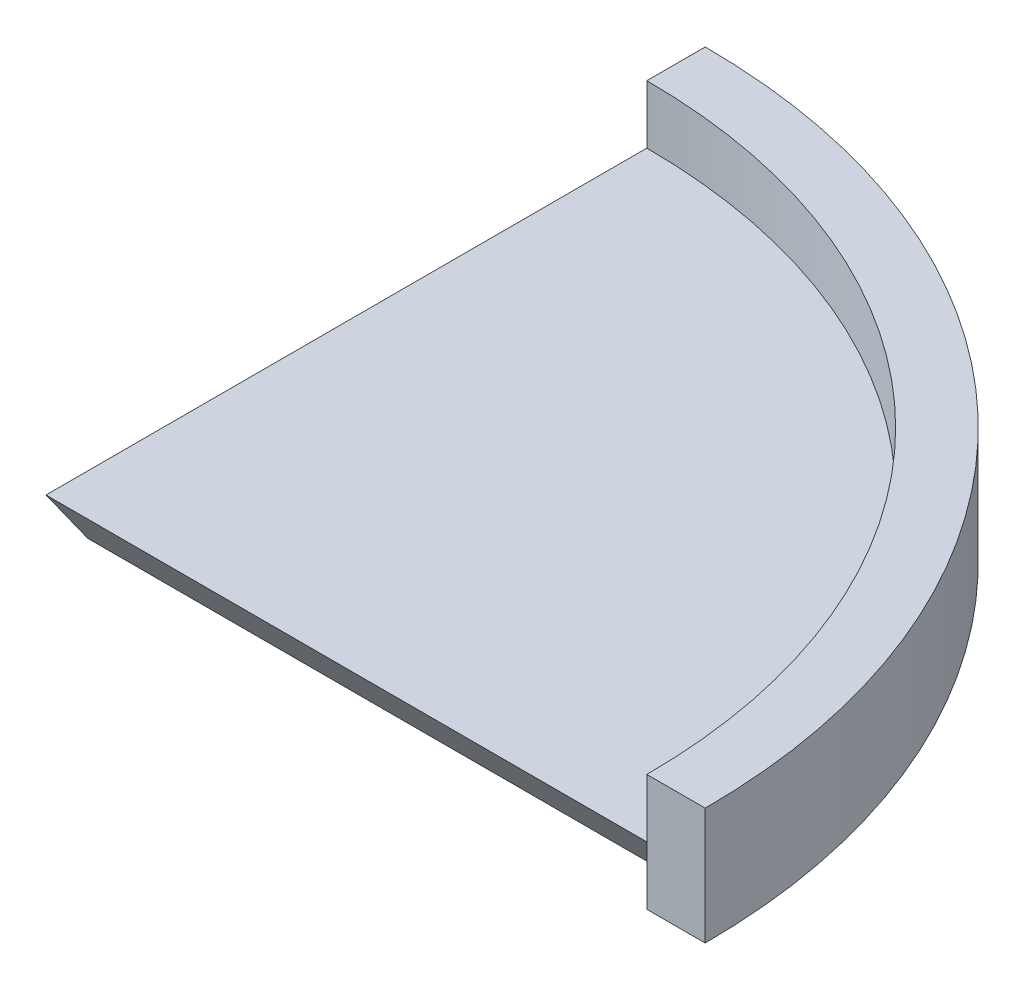
ISO-10303-21;
HEADER;
FILE_DESCRIPTION(('STEP AP214'),'2;1');
FILE_NAME('part.step','',(''),(''),'','','');
FILE_SCHEMA(('AUTOMOTIVE_DESIGN { 1 0 10303 214 1 1 1 1 }'));
ENDSEC;
DATA;
#1=APPLICATION_CONTEXT('core data for automotive mechanical design processes');
#2=APPLICATION_PROTOCOL_DEFINITION('international standard','automotive_design',2000,#1);
#3=PRODUCT_CONTEXT('',#1,'mechanical');
#4=PRODUCT('Part','Part','',(#3));
#5=PRODUCT_RELATED_PRODUCT_CATEGORY('part','',(#4));
#6=PRODUCT_DEFINITION_FORMATION('','',#4);
#7=PRODUCT_DEFINITION_CONTEXT('part definition',#1,'design');
#8=PRODUCT_DEFINITION('design','',#6,#7);
#9=PRODUCT_DEFINITION_SHAPE('','',#8);
#10=(LENGTH_UNIT() NAMED_UNIT(*) SI_UNIT(.MILLI.,.METRE.));
#11=(NAMED_UNIT(*) PLANE_ANGLE_UNIT() SI_UNIT($,.RADIAN.));
#12=(NAMED_UNIT(*) SI_UNIT($,.STERADIAN.) SOLID_ANGLE_UNIT());
#13=UNCERTAINTY_MEASURE_WITH_UNIT(LENGTH_MEASURE(1.E-05),#10,'distance_accuracy_value','');
#14=(GEOMETRIC_REPRESENTATION_CONTEXT(3) GLOBAL_UNCERTAINTY_ASSIGNED_CONTEXT((#13)) GLOBAL_UNIT_ASSIGNED_CONTEXT((#10,
#11,#12)) REPRESENTATION_CONTEXT('',''));
#15=CARTESIAN_POINT('',(0.,0.,0.));
#16=DIRECTION('',(0.,0.,1.));
#17=DIRECTION('',(1.,0.,0.));
#18=AXIS2_PLACEMENT_3D('',#15,#16,#17);
#19=CARTESIAN_POINT('',(0.,408.76275485835,925.416095405554));
#20=DIRECTION('',(0.,-1.,0.));
#21=DIRECTION('',(0.,0.,-1.));
#22=AXIS2_PLACEMENT_3D('',#19,#20,#21);
#23=PLANE('',#22);
#24=DIRECTION('',(-1.,0.,0.));
#25=VECTOR('',#24,1.);
#26=CARTESIAN_POINT('',(0.,408.76275485835,925.416095405554));
#27=LINE('',#26,#25);
#28=CARTESIAN_POINT('',(360.,408.76275485835,925.416095405554));
#29=VERTEX_POINT('',#28);
#30=CARTESIAN_POINT('',(0.,408.76275485835,925.416095405554));
#31=VERTEX_POINT('',#30);
#32=EDGE_CURVE('E43',#29,#31,#27,.T.);
#33=ORIENTED_EDGE('',*,*,#32,.F.);
#34=CARTESIAN_POINT('',(0.,408.76275485835,925.416095405554));
#35=DIRECTION('',(0.,1.,0.));
#36=DIRECTION('',(0.,0.,1.));
#37=AXIS2_PLACEMENT_3D('',#34,#35,#36);
#38=CIRCLE('',#37,360.);
#39=CARTESIAN_POINT('',(0.,408.76275485835,565.416095405554));
#40=VERTEX_POINT('',#39);
#41=EDGE_CURVE('E104',#29,#40,#38,.T.);
#42=ORIENTED_EDGE('',*,*,#41,.T.);
#43=DIRECTION('',(0.,0.,1.));
#44=VECTOR('',#43,1.);
#45=CARTESIAN_POINT('',(0.,408.76275485835,925.416095405554));
#46=LINE('',#45,#44);
#47=EDGE_CURVE('E117',#40,#31,#46,.T.);
#48=ORIENTED_EDGE('',*,*,#47,.T.);
#49=EDGE_LOOP('',(#33,#42,#48));
#50=FACE_BOUND('',#49,.T.);
#51=ADVANCED_FACE('F35',(#50),#23,.F.);
#52=CARTESIAN_POINT('',(0.,373.76275485835,925.416095405554));
#53=DIRECTION('',(0.,1.,0.));
#54=DIRECTION('',(0.,0.,1.));
#55=AXIS2_PLACEMENT_3D('',#52,#53,#54);
#56=PLANE('',#55);
#57=DIRECTION('',(0.,0.,1.));
#58=VECTOR('',#57,1.);
#59=CARTESIAN_POINT('',(360.,373.76275485835,925.416095405554));
#60=LINE('',#59,#58);
#61=CARTESIAN_POINT('',(360.,373.76275485835,900.416095405554));
#62=VERTEX_POINT('',#61);
#63=CARTESIAN_POINT('',(360.,373.76275485835,925.416095405554));
#64=VERTEX_POINT('',#63);
#65=EDGE_CURVE('E93',#62,#64,#60,.T.);
#66=ORIENTED_EDGE('',*,*,#65,.F.);
#67=DIRECTION('',(-1.,0.,0.));
#68=VECTOR('',#67,1.);
#69=CARTESIAN_POINT('',(360.,373.76275485835,900.416095405554));
#70=LINE('',#69,#68);
#71=CARTESIAN_POINT('',(0.,373.76275485835,900.416095405554));
#72=VERTEX_POINT('',#71);
#73=EDGE_CURVE('E90',#62,#72,#70,.T.);
#74=ORIENTED_EDGE('',*,*,#73,.T.);
#75=DIRECTION('',(0.,0.,-1.));
#76=VECTOR('',#75,1.);
#77=CARTESIAN_POINT('',(0.,373.76275485835,925.416095405554));
#78=LINE('',#77,#76);
#79=CARTESIAN_POINT('',(0.,373.76275485835,530.416095405554));
#80=VERTEX_POINT('',#79);
#81=EDGE_CURVE('E126',#72,#80,#78,.T.);
#82=ORIENTED_EDGE('',*,*,#81,.T.);
#83=CARTESIAN_POINT('',(0.,373.76275485835,925.416095405554));
#84=DIRECTION('',(0.,1.,0.));
#85=DIRECTION('',(0.,0.,1.));
#86=AXIS2_PLACEMENT_3D('',#83,#84,#85);
#87=CIRCLE('',#86,395.);
#88=CARTESIAN_POINT('',(395.,373.76275485835,925.416095405555));
#89=VERTEX_POINT('',#88);
#90=EDGE_CURVE('E11',#89,#80,#87,.T.);
#91=ORIENTED_EDGE('',*,*,#90,.F.);
#92=DIRECTION('',(1.,0.,0.));
#93=VECTOR('',#92,1.);
#94=CARTESIAN_POINT('',(0.,373.76275485835,925.416095405554));
#95=LINE('',#94,#93);
#96=EDGE_CURVE('E119',#64,#89,#95,.T.);
#97=ORIENTED_EDGE('',*,*,#96,.F.);
#98=EDGE_LOOP('',(#66,#74,#82,#91,#97));
#99=FACE_BOUND('',#98,.T.);
#100=ADVANCED_FACE('F37',(#99),#56,.F.);
#101=CARTESIAN_POINT('',(0.,408.76275485835,925.416095405554));
#102=DIRECTION('',(0.,1.,0.));
#103=DIRECTION('',(0.,0.,1.));
#104=AXIS2_PLACEMENT_3D('',#101,#102,#103);
#105=CYLINDRICAL_SURFACE('',#104,395.);
#106=DIRECTION('',(0.,1.,0.));
#107=VECTOR('',#106,1.);
#108=CARTESIAN_POINT('',(0.,408.76275485835,530.416095405554));
#109=LINE('',#108,#107);
#110=CARTESIAN_POINT('',(0.,443.76275485835,530.416095405554));
#111=VERTEX_POINT('',#110);
#112=EDGE_CURVE('E124',#80,#111,#109,.T.);
#113=ORIENTED_EDGE('',*,*,#112,.T.);
#114=CARTESIAN_POINT('',(0.,443.76275485835,925.416095405554));
#115=DIRECTION('',(0.,1.,0.));
#116=DIRECTION('',(0.,0.,1.));
#117=AXIS2_PLACEMENT_3D('',#114,#115,#116);
#118=CIRCLE('',#117,395.);
#119=CARTESIAN_POINT('',(395.,443.76275485835,925.416095405555));
#120=VERTEX_POINT('',#119);
#121=EDGE_CURVE('E128',#120,#111,#118,.T.);
#122=ORIENTED_EDGE('',*,*,#121,.F.);
#123=DIRECTION('',(0.,1.,0.));
#124=VECTOR('',#123,1.);
#125=CARTESIAN_POINT('',(395.,408.76275485835,925.416095405555));
#126=LINE('',#125,#124);
#127=EDGE_CURVE('E118',#89,#120,#126,.T.);
#128=ORIENTED_EDGE('',*,*,#127,.F.);
#129=ORIENTED_EDGE('',*,*,#90,.T.);
#130=EDGE_LOOP('',(#113,#122,#128,#129));
#131=FACE_BOUND('',#130,.T.);
#132=ADVANCED_FACE('F148',(#131),#105,.T.);
#133=CARTESIAN_POINT('',(925.416095405554,0.,925.416095405557));
#134=DIRECTION('',(0.,0.,1.));
#135=DIRECTION('',(1.,0.,0.));
#136=AXIS2_PLACEMENT_3D('',#133,#134,#135);
#137=PLANE('',#136);
#138=DIRECTION('',(0.,1.,0.));
#139=VECTOR('',#138,1.);
#140=CARTESIAN_POINT('',(360.,408.76275485835,925.416095405554));
#141=LINE('',#140,#139);
#142=EDGE_CURVE('E94',#64,#29,#141,.T.);
#143=ORIENTED_EDGE('',*,*,#142,.F.);
#144=ORIENTED_EDGE('',*,*,#96,.T.);
#145=ORIENTED_EDGE('',*,*,#127,.T.);
#146=DIRECTION('',(-1.,0.,0.));
#147=VECTOR('',#146,1.);
#148=CARTESIAN_POINT('',(395.,443.76275485835,925.416095405555));
#149=LINE('',#148,#147);
#150=CARTESIAN_POINT('',(360.,443.76275485835,925.416095405555));
#151=VERTEX_POINT('',#150);
#152=EDGE_CURVE('E115',#120,#151,#149,.T.);
#153=ORIENTED_EDGE('',*,*,#152,.T.);
#154=DIRECTION('',(0.,-1.,0.));
#155=VECTOR('',#154,1.);
#156=CARTESIAN_POINT('',(360.,408.76275485835,925.416095405555));
#157=LINE('',#156,#155);
#158=EDGE_CURVE('E106',#151,#29,#157,.T.);
#159=ORIENTED_EDGE('',*,*,#158,.T.);
#160=EDGE_LOOP('',(#143,#144,#145,#153,#159));
#161=FACE_BOUND('',#160,.T.);
#162=ADVANCED_FACE('F113',(#161),#137,.T.);
#163=CARTESIAN_POINT('',(0.,0.,0.));
#164=DIRECTION('',(1.,0.,0.));
#165=DIRECTION('',(0.,0.,-1.));
#166=AXIS2_PLACEMENT_3D('',#163,#164,#165);
#167=PLANE('',#166);
#168=ORIENTED_EDGE('',*,*,#81,.F.);
#169=DIRECTION('',(0.,-0.813733471206735,-0.581238193719097));
#170=VECTOR('',#169,1.);
#171=CARTESIAN_POINT('',(0.,373.76275485835,900.416095405554));
#172=LINE('',#171,#170);
#173=EDGE_CURVE('E101',#31,#72,#172,.T.);
#174=ORIENTED_EDGE('',*,*,#173,.F.);
#175=ORIENTED_EDGE('',*,*,#47,.F.);
#176=DIRECTION('',(0.,-1.,0.));
#177=VECTOR('',#176,1.);
#178=CARTESIAN_POINT('',(0.,408.76275485835,565.416095405554));
#179=LINE('',#178,#177);
#180=CARTESIAN_POINT('',(0.,443.76275485835,565.416095405554));
#181=VERTEX_POINT('',#180);
#182=EDGE_CURVE('E50',#181,#40,#179,.T.);
#183=ORIENTED_EDGE('',*,*,#182,.F.);
#184=DIRECTION('',(0.,0.,1.));
#185=VECTOR('',#184,1.);
#186=CARTESIAN_POINT('',(0.,443.76275485835,530.416095405554));
#187=LINE('',#186,#185);
#188=EDGE_CURVE('E134',#111,#181,#187,.T.);
#189=ORIENTED_EDGE('',*,*,#188,.F.);
#190=ORIENTED_EDGE('',*,*,#112,.F.);
#191=EDGE_LOOP('',(#168,#174,#175,#183,#189,#190));
#192=FACE_BOUND('',#191,.T.);
#193=ADVANCED_FACE('F144',(#192),#167,.F.);
#194=CARTESIAN_POINT('',(395.,443.76275485835,925.416095405555));
#195=DIRECTION('',(0.,-1.,0.));
#196=DIRECTION('',(0.,0.,-1.));
#197=AXIS2_PLACEMENT_3D('',#194,#195,#196);
#198=PLANE('',#197);
#199=CARTESIAN_POINT('',(0.,443.76275485835,925.416095405554));
#200=DIRECTION('',(0.,1.,0.));
#201=DIRECTION('',(0.,0.,1.));
#202=AXIS2_PLACEMENT_3D('',#199,#200,#201);
#203=CIRCLE('',#202,360.);
#204=EDGE_CURVE('E110',#151,#181,#203,.T.);
#205=ORIENTED_EDGE('',*,*,#204,.F.);
#206=ORIENTED_EDGE('',*,*,#152,.F.);
#207=ORIENTED_EDGE('',*,*,#121,.T.);
#208=ORIENTED_EDGE('',*,*,#188,.T.);
#209=EDGE_LOOP('',(#205,#206,#207,#208));
#210=FACE_BOUND('',#209,.T.);
#211=ADVANCED_FACE('F151',(#210),#198,.F.);
#212=CARTESIAN_POINT('',(0.,408.76275485835,925.416095405554));
#213=DIRECTION('',(0.,1.,0.));
#214=DIRECTION('',(0.,0.,1.));
#215=AXIS2_PLACEMENT_3D('',#212,#213,#214);
#216=CYLINDRICAL_SURFACE('',#215,360.);
#217=ORIENTED_EDGE('',*,*,#41,.F.);
#218=ORIENTED_EDGE('',*,*,#158,.F.);
#219=ORIENTED_EDGE('',*,*,#204,.T.);
#220=ORIENTED_EDGE('',*,*,#182,.T.);
#221=EDGE_LOOP('',(#217,#218,#219,#220));
#222=FACE_BOUND('',#221,.T.);
#223=ADVANCED_FACE('F105',(#222),#216,.F.);
#224=CARTESIAN_POINT('',(360.,373.76275485835,900.416095405554));
#225=DIRECTION('',(0.,0.581238193719097,-0.813733471206735));
#226=DIRECTION('',(0.,0.813733471206735,0.581238193719097));
#227=AXIS2_PLACEMENT_3D('',#224,#225,#226);
#228=PLANE('',#227);
#229=ORIENTED_EDGE('',*,*,#173,.T.);
#230=ORIENTED_EDGE('',*,*,#73,.F.);
#231=DIRECTION('',(0.,-0.813733471206735,-0.581238193719097));
#232=VECTOR('',#231,1.);
#233=CARTESIAN_POINT('',(360.,373.76275485835,900.416095405554));
#234=LINE('',#233,#232);
#235=EDGE_CURVE('E86',#29,#62,#234,.T.);
#236=ORIENTED_EDGE('',*,*,#235,.F.);
#237=ORIENTED_EDGE('',*,*,#32,.T.);
#238=EDGE_LOOP('',(#229,#230,#236,#237));
#239=FACE_BOUND('',#238,.T.);
#240=ADVANCED_FACE('F88',(#239),#228,.F.);
#241=CARTESIAN_POINT('',(360.,0.,0.));
#242=DIRECTION('',(1.,0.,0.));
#243=DIRECTION('',(0.,0.,-1.));
#244=AXIS2_PLACEMENT_3D('',#241,#242,#243);
#245=PLANE('',#244);
#246=ORIENTED_EDGE('',*,*,#142,.T.);
#247=ORIENTED_EDGE('',*,*,#235,.T.);
#248=ORIENTED_EDGE('',*,*,#65,.T.);
#249=EDGE_LOOP('',(#246,#247,#248));
#250=FACE_BOUND('',#249,.T.);
#251=ADVANCED_FACE('F97',(#250),#245,.F.);
#252=CLOSED_SHELL('',(#51,#100,#132,#162,#193,#211,#223,#240,#251));
#253=MANIFOLD_SOLID_BREP('B2',#252);
#254=ADVANCED_BREP_SHAPE_REPRESENTATION('',(#18,#253),#14);
#255=SHAPE_DEFINITION_REPRESENTATION(#9,#254);
ENDSEC;
END-ISO-10303-21;
